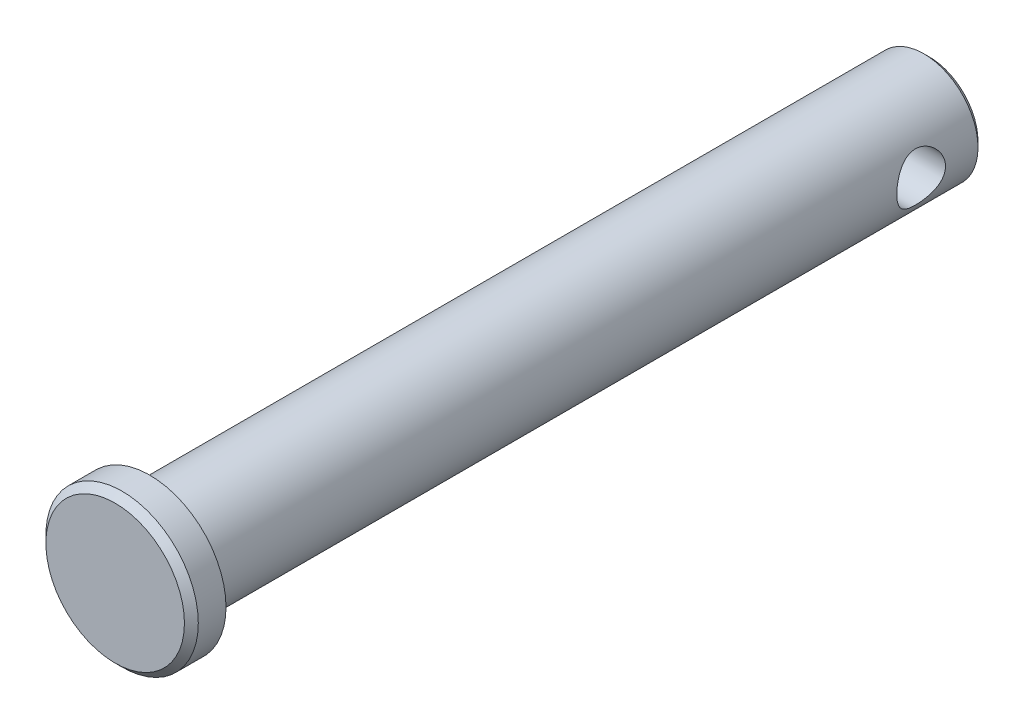
ISO-10303-21;
HEADER;
FILE_DESCRIPTION(('STEP AP214'),'2;1');
FILE_NAME('part.step','',(''),(''),'','','');
FILE_SCHEMA(('AUTOMOTIVE_DESIGN { 1 0 10303 214 1 1 1 1 }'));
ENDSEC;
DATA;
#1=APPLICATION_CONTEXT('core data for automotive mechanical design processes');
#2=APPLICATION_PROTOCOL_DEFINITION('international standard','automotive_design',2000,#1);
#3=PRODUCT_CONTEXT('',#1,'mechanical');
#4=PRODUCT('Part','Part','',(#3));
#5=PRODUCT_RELATED_PRODUCT_CATEGORY('part','',(#4));
#6=PRODUCT_DEFINITION_FORMATION('','',#4);
#7=PRODUCT_DEFINITION_CONTEXT('part definition',#1,'design');
#8=PRODUCT_DEFINITION('design','',#6,#7);
#9=PRODUCT_DEFINITION_SHAPE('','',#8);
#10=(LENGTH_UNIT() NAMED_UNIT(*) SI_UNIT(.MILLI.,.METRE.));
#11=(NAMED_UNIT(*) PLANE_ANGLE_UNIT() SI_UNIT($,.RADIAN.));
#12=(NAMED_UNIT(*) SI_UNIT($,.STERADIAN.) SOLID_ANGLE_UNIT());
#13=UNCERTAINTY_MEASURE_WITH_UNIT(LENGTH_MEASURE(1.E-05),#10,'distance_accuracy_value','');
#14=(GEOMETRIC_REPRESENTATION_CONTEXT(3) GLOBAL_UNCERTAINTY_ASSIGNED_CONTEXT((#13)) GLOBAL_UNIT_ASSIGNED_CONTEXT((#10,
#11,#12)) REPRESENTATION_CONTEXT('',''));
#15=CARTESIAN_POINT('',(0.,0.,0.));
#16=DIRECTION('',(0.,0.,1.));
#17=DIRECTION('',(1.,0.,0.));
#18=AXIS2_PLACEMENT_3D('',#15,#16,#17);
#19=CARTESIAN_POINT('',(0.,0.,28.575));
#20=DIRECTION('',(0.,0.,-1.));
#21=DIRECTION('',(-1.,0.,0.));
#22=AXIS2_PLACEMENT_3D('',#19,#20,#21);
#23=CYLINDRICAL_SURFACE('',#22,3.96875);
#24=CARTESIAN_POINT('',(0.,0.,-28.178125));
#25=DIRECTION('',(0.,0.,1.));
#26=DIRECTION('',(1.,0.,0.));
#27=AXIS2_PLACEMENT_3D('',#24,#25,#26);
#28=CIRCLE('',#27,3.96875);
#29=CARTESIAN_POINT('',(3.96875,0.,-28.178125));
#30=VERTEX_POINT('',#29);
#31=EDGE_CURVE('E39',#30,#30,#28,.T.);
#32=ORIENTED_EDGE('',*,*,#31,.T.);
#33=EDGE_LOOP('',(#32));
#34=FACE_BOUND('',#33,.T.);
#35=CARTESIAN_POINT('',(-3.96875,0.,-22.225));
#36=CARTESIAN_POINT('',(-3.96874617438622,-0.0949778738234464,-22.2250046427767));
#37=CARTESIAN_POINT('',(-3.96530259934115,-0.190100910102063,-22.2326211474799));
#38=CARTESIAN_POINT('',(-3.95186976524683,-0.377603398261746,-22.2627821054392));
#39=CARTESIAN_POINT('',(-3.94186507359599,-0.469975843546831,-22.2853617552799));
#40=CARTESIAN_POINT('',(-3.91637069606117,-0.648968721826522,-22.3444262458808));
#41=CARTESIAN_POINT('',(-3.90090078285467,-0.73560857063118,-22.3808609959748));
#42=CARTESIAN_POINT('',(-3.86594877361354,-0.9014479992857,-22.4663743710802));
#43=CARTESIAN_POINT('',(-3.84646753179613,-0.980649157993283,-22.5154503046938));
#44=CARTESIAN_POINT('',(-3.80416954815373,-1.13398432523679,-22.6277723638741));
#45=CARTESIAN_POINT('',(-3.7812323323631,-1.20764366282281,-22.6916206015973));
#46=CARTESIAN_POINT('',(-3.73507740763258,-1.34362938308817,-22.8303950283803));
#47=CARTESIAN_POINT('',(-3.71185953645299,-1.40594884000918,-22.9053279370255));
#48=CARTESIAN_POINT('',(-3.66620670648197,-1.52117571586779,-23.0695331682094));
#49=CARTESIAN_POINT('',(-3.64390071699522,-1.57330159549786,-23.1593936932781));
#50=CARTESIAN_POINT('',(-3.60455031138587,-1.66148802946916,-23.3477446575103));
#51=CARTESIAN_POINT('',(-3.58750275311297,-1.69755818356413,-23.4462298976649));
#52=CARTESIAN_POINT('',(-3.56192529512775,-1.75056975181475,-23.643584616897));
#53=CARTESIAN_POINT('',(-3.55298881993969,-1.76843057064752,-23.7421521796414));
#54=CARTESIAN_POINT('',(-3.54350139065343,-1.78737214090788,-23.9412584741968));
#55=CARTESIAN_POINT('',(-3.54294461635166,-1.78846453901733,-24.0417957892951));
#56=CARTESIAN_POINT('',(-3.54994141249622,-1.77452269382132,-24.2320619163113));
#57=CARTESIAN_POINT('',(-3.55675159739714,-1.76096672628881,-24.3219322875282));
#58=CARTESIAN_POINT('',(-3.57644085651668,-1.72062366969459,-24.4979523188023));
#59=CARTESIAN_POINT('',(-3.58932134024889,-1.69383350760461,-24.5841011096402));
#60=CARTESIAN_POINT('',(-3.61999879597095,-1.62725210855022,-24.7525688156485));
#61=CARTESIAN_POINT('',(-3.63790043052348,-1.58718038036525,-24.834756944716));
#62=CARTESIAN_POINT('',(-3.67658878575605,-1.49537598597763,-24.9915950627164));
#63=CARTESIAN_POINT('',(-3.69737673266191,-1.44363835775408,-25.0662418243522));
#64=CARTESIAN_POINT('',(-3.74202161728027,-1.32390460607897,-25.2137470977053));
#65=CARTESIAN_POINT('',(-3.76597742851696,-1.25479921909777,-25.2856780777331));
#66=CARTESIAN_POINT('',(-3.81252979441669,-1.10531402437862,-25.4172706801132));
#67=CARTESIAN_POINT('',(-3.83512591597318,-1.02493065110592,-25.4769284075093));
#68=CARTESIAN_POINT('',(-3.87728164517011,-0.851950400611567,-25.5839624966866));
#69=CARTESIAN_POINT('',(-3.89672549715337,-0.759052301739587,-25.6309011333037));
#70=CARTESIAN_POINT('',(-3.92946512008061,-0.565578480308637,-25.7081480148423));
#71=CARTESIAN_POINT('',(-3.94276486430751,-0.465007768662619,-25.738467009758));
#72=CARTESIAN_POINT('',(-3.96093706398566,-0.266740423937717,-25.7795331552533));
#73=CARTESIAN_POINT('',(-3.96634260111458,-0.169349837037099,-25.7915212438187));
#74=CARTESIAN_POINT('',(-3.96986639576799,0.0261960161241927,-25.7993589404276));
#75=CARTESIAN_POINT('',(-3.96798721258835,0.124351001740544,-25.7952142163107));
#76=CARTESIAN_POINT('',(-3.9574884590475,0.312425077700258,-25.7717349306814));
#77=CARTESIAN_POINT('',(-3.94927933787845,0.402485338607084,-25.7533250159671));
#78=CARTESIAN_POINT('',(-3.92741674577169,0.578108898424094,-25.7031862033162));
#79=CARTESIAN_POINT('',(-3.91376261909991,0.663671654301141,-25.6714557011765));
#80=CARTESIAN_POINT('',(-3.88175972760448,0.830900107030836,-25.5945762664853));
#81=CARTESIAN_POINT('',(-3.86327809956836,0.912361689031191,-25.5490405132584));
#82=CARTESIAN_POINT('',(-3.82352241163919,1.0667805898273,-25.4462646377431));
#83=CARTESIAN_POINT('',(-3.80224713175163,1.13973416672261,-25.3890193957655));
#84=CARTESIAN_POINT('',(-3.7569861365271,1.28140881747875,-25.2589582979106));
#85=CARTESIAN_POINT('',(-3.73292154548769,1.34928558884681,-25.1852480267837));
#86=CARTESIAN_POINT('',(-3.68626006612451,1.47199966484125,-25.0272069274033));
#87=CARTESIAN_POINT('',(-3.66366374315174,1.52683196811846,-24.9428720444865));
#88=CARTESIAN_POINT('',(-3.6220582670028,1.62311458805353,-24.7630854798547));
#89=CARTESIAN_POINT('',(-3.60315571336035,1.6641865299815,-24.6674045361922));
#90=CARTESIAN_POINT('',(-3.57239877714008,1.72923710343425,-24.4693548110904));
#91=CARTESIAN_POINT('',(-3.5605372740767,1.75323300854316,-24.3669929026995));
#92=CARTESIAN_POINT('',(-3.54641768025877,1.78160782388325,-24.1679829916353));
#93=CARTESIAN_POINT('',(-3.54341998323755,1.78749927212071,-24.0716029311388));
#94=CARTESIAN_POINT('',(-3.54535000484541,1.78366948684158,-23.8792459226279));
#95=CARTESIAN_POINT('',(-3.55027591495678,1.77395181601726,-23.7832688876381));
#96=CARTESIAN_POINT('',(-3.56677687348632,1.74051392909838,-23.600753041163));
#97=CARTESIAN_POINT('',(-3.57791211367527,1.71771729466601,-23.5140010549911));
#98=CARTESIAN_POINT('',(-3.6051626662439,1.65975853119642,-23.3455710308186));
#99=CARTESIAN_POINT('',(-3.62127942761947,1.62459280389832,-23.2638944774435));
#100=CARTESIAN_POINT('',(-3.65796501776635,1.54029485813948,-23.1021393255862));
#101=CARTESIAN_POINT('',(-3.67875446372189,1.49040607677893,-23.022506198301));
#102=CARTESIAN_POINT('',(-3.7219314339033,1.37904587307234,-22.8722730048114));
#103=CARTESIAN_POINT('',(-3.74431964392808,1.31756946138292,-22.80167685177));
#104=CARTESIAN_POINT('',(-3.7906044226433,1.17819988334134,-22.6649100431823));
#105=CARTESIAN_POINT('',(-3.81445387976054,1.09932398288879,-22.5997198054072));
#106=CARTESIAN_POINT('',(-3.85900563461188,0.930928545506918,-22.4833857784195));
#107=CARTESIAN_POINT('',(-3.87970648291034,0.841404140216964,-22.4322484496596));
#108=CARTESIAN_POINT('',(-3.91548302476265,0.654900541569406,-22.3462695978331));
#109=CARTESIAN_POINT('',(-3.9306127661094,0.55800461146758,-22.311270622202));
#110=CARTESIAN_POINT('',(-3.95373955592654,0.358998712324301,-22.2584461799785));
#111=CARTESIAN_POINT('',(-3.9617582306156,0.256905557576824,-22.2405686302521));
#112=CARTESIAN_POINT('',(-3.96675460869473,0.128456865581506,-22.2294387628093));
#113=CARTESIAN_POINT('',(-3.96750154708539,0.102802547124715,-22.2277758382382));
#114=CARTESIAN_POINT('',(-3.96849976418159,0.0514357022290038,-22.2255558205572));
#115=CARTESIAN_POINT('',(-3.96875103610376,0.0257231749982957,-22.2249987425813));
#116=CARTESIAN_POINT('',(-3.96875,0.,-22.225));
#117=B_SPLINE_CURVE_WITH_KNOTS('',3,(#35,#36,#37,#38,#39,#40,#41,#42,#43,#44,#45,#46,#47,#48,
#49,#50,#51,#52,#53,#54,#55,#56,#57,#58,#59,#60,#61,#62,#63,#64,#65,#66,#67,#68,#69,#70,#71,#72,
#73,#74,#75,#76,#77,#78,#79,#80,#81,#82,#83,#84,#85,#86,#87,#88,#89,#90,#91,#92,#93,#94,#95,#96,
#97,#98,#99,#100,#101,#102,#103,#104,#105,#106,#107,#108,#109,#110,#111,#112,#113,#114,#115,
#116),.UNSPECIFIED.,.T.,.F.,(4,2,2,2,2,2,2,2,2,2,2,2,2,2,2,2,2,2,2,2,2,2,2,2,2,2,2,2,2,2,2,2,2,
2,2,2,2,2,2,2,4),(0.,0.284828038773508,0.570328444753487,0.854806339300564,1.13922371647665,
1.43836698800565,1.73769235057742,2.05484351698026,2.37180480245164,2.67182404149381,
2.97163488960178,3.24379026768139,3.51600887095951,3.79438770250797,4.07288516494024,
4.37926965204658,4.68575122177785,5.00172742428918,5.31749900370299,5.6107643968995,
5.9039267683125,6.17953050358859,6.45516743944876,6.73938144201626,7.02371997688967,
7.33149162707357,7.63938108977513,7.95514987865638,8.27059878990355,8.55885899679168,
8.84705341928244,9.11703762338688,9.38710043294565,9.67464025936009,9.96230417721748,
10.2760302632386,10.5899003361528,10.9006397585277,11.2104308849967,11.2875707589972,
11.3647116886774),.UNSPECIFIED.);
#118=CARTESIAN_POINT('',(-3.96875,0.,-22.225));
#119=VERTEX_POINT('',#118);
#120=EDGE_CURVE('E50',#119,#119,#117,.T.);
#121=ORIENTED_EDGE('',*,*,#120,.T.);
#122=EDGE_LOOP('',(#121));
#123=FACE_BOUND('',#122,.T.);
#124=CARTESIAN_POINT('',(3.96875,0.,-25.796875));
#125=CARTESIAN_POINT('',(3.96874617438622,-0.0949778738234461,-25.7968703572233));
#126=CARTESIAN_POINT('',(3.96530259934115,-0.190100910102062,-25.7892538525201));
#127=CARTESIAN_POINT('',(3.95186976524683,-0.377603398261745,-25.7590928945608));
#128=CARTESIAN_POINT('',(3.94186507359599,-0.469975843546831,-25.7365132447201));
#129=CARTESIAN_POINT('',(3.91637069606117,-0.648968721826522,-25.6774487541192));
#130=CARTESIAN_POINT('',(3.90090078285467,-0.73560857063118,-25.6410140040252));
#131=CARTESIAN_POINT('',(3.86594877361354,-0.9014479992857,-25.5555006289198));
#132=CARTESIAN_POINT('',(3.84646753179613,-0.980649157993283,-25.5064246953062));
#133=CARTESIAN_POINT('',(3.80416954815373,-1.13398432523679,-25.3941026361259));
#134=CARTESIAN_POINT('',(3.7812323323631,-1.20764366282281,-25.3302543984027));
#135=CARTESIAN_POINT('',(3.73507740763258,-1.34362938308817,-25.1914799716197));
#136=CARTESIAN_POINT('',(3.71185953645299,-1.40594884000918,-25.1165470629745));
#137=CARTESIAN_POINT('',(3.66620670648197,-1.52117571586779,-24.9523418317906));
#138=CARTESIAN_POINT('',(3.64390071699522,-1.57330159549786,-24.8624813067219));
#139=CARTESIAN_POINT('',(3.60455031138587,-1.66148802946916,-24.6741303424897));
#140=CARTESIAN_POINT('',(3.58750275311297,-1.69755818356413,-24.5756451023351));
#141=CARTESIAN_POINT('',(3.56192529512775,-1.75056975181475,-24.378290383103));
#142=CARTESIAN_POINT('',(3.55298881993969,-1.76843057064752,-24.2797228203586));
#143=CARTESIAN_POINT('',(3.54350139065343,-1.78737214090788,-24.0806165258032));
#144=CARTESIAN_POINT('',(3.54294461635166,-1.78846453901733,-23.9800792107049));
#145=CARTESIAN_POINT('',(3.54994141249622,-1.77452269382132,-23.7898130836887));
#146=CARTESIAN_POINT('',(3.55675159739714,-1.76096672628881,-23.6999427124718));
#147=CARTESIAN_POINT('',(3.57644085651668,-1.72062366969459,-23.5239226811977));
#148=CARTESIAN_POINT('',(3.58932134024889,-1.69383350760461,-23.4377738903598));
#149=CARTESIAN_POINT('',(3.61999879597095,-1.62725210855022,-23.2693061843515));
#150=CARTESIAN_POINT('',(3.63790043052348,-1.58718038036525,-23.187118055284));
#151=CARTESIAN_POINT('',(3.67658878575605,-1.49537598597763,-23.0302799372836));
#152=CARTESIAN_POINT('',(3.69737673266191,-1.44363835775408,-22.9556331756478));
#153=CARTESIAN_POINT('',(3.74202161728027,-1.32390460607897,-22.8081279022947));
#154=CARTESIAN_POINT('',(3.76597742851696,-1.25479921909777,-22.7361969222669));
#155=CARTESIAN_POINT('',(3.81252979441669,-1.10531402437862,-22.6046043198868));
#156=CARTESIAN_POINT('',(3.83512591597318,-1.02493065110592,-22.5449465924907));
#157=CARTESIAN_POINT('',(3.87728164517011,-0.851950400611567,-22.4379125033134));
#158=CARTESIAN_POINT('',(3.89672549715337,-0.759052301739587,-22.3909738666963));
#159=CARTESIAN_POINT('',(3.92946512008061,-0.565578480308637,-22.3137269851577));
#160=CARTESIAN_POINT('',(3.94276486430751,-0.465007768662619,-22.283407990242));
#161=CARTESIAN_POINT('',(3.96093706398566,-0.266740423937717,-22.2423418447467));
#162=CARTESIAN_POINT('',(3.96634260111458,-0.169349837037099,-22.2303537561813));
#163=CARTESIAN_POINT('',(3.96986639576799,0.0261960161241927,-22.2225160595724));
#164=CARTESIAN_POINT('',(3.96798721258835,0.124351001740544,-22.2266607836893));
#165=CARTESIAN_POINT('',(3.9574884590475,0.312425077700258,-22.2501400693186));
#166=CARTESIAN_POINT('',(3.94927933787845,0.402485338607084,-22.2685499840329));
#167=CARTESIAN_POINT('',(3.92741674577169,0.578108898424094,-22.3186887966838));
#168=CARTESIAN_POINT('',(3.91376261909991,0.663671654301141,-22.3504192988235));
#169=CARTESIAN_POINT('',(3.88175972760448,0.830900107030836,-22.4272987335147));
#170=CARTESIAN_POINT('',(3.86327809956836,0.912361689031191,-22.4728344867416));
#171=CARTESIAN_POINT('',(3.82352241163919,1.0667805898273,-22.5756103622569));
#172=CARTESIAN_POINT('',(3.80224713175163,1.13973416672261,-22.6328556042345));
#173=CARTESIAN_POINT('',(3.7569861365271,1.28140881747875,-22.7629167020894));
#174=CARTESIAN_POINT('',(3.73292154548769,1.34928558884681,-22.8366269732163));
#175=CARTESIAN_POINT('',(3.68626006612451,1.47199966484125,-22.9946680725967));
#176=CARTESIAN_POINT('',(3.66366374315174,1.52683196811846,-23.0790029555135));
#177=CARTESIAN_POINT('',(3.6220582670028,1.62311458805353,-23.2587895201453));
#178=CARTESIAN_POINT('',(3.60315571336035,1.6641865299815,-23.3544704638078));
#179=CARTESIAN_POINT('',(3.57239877714008,1.72923710343425,-23.5525201889096));
#180=CARTESIAN_POINT('',(3.5605372740767,1.75323300854316,-23.6548820973005));
#181=CARTESIAN_POINT('',(3.54641768025877,1.78160782388325,-23.8538920083647));
#182=CARTESIAN_POINT('',(3.54341998323755,1.78749927212071,-23.9502720688612));
#183=CARTESIAN_POINT('',(3.54535000484541,1.78366948684158,-24.1426290773721));
#184=CARTESIAN_POINT('',(3.55027591495678,1.77395181601726,-24.2386061123619));
#185=CARTESIAN_POINT('',(3.56677687348632,1.74051392909838,-24.421121958837));
#186=CARTESIAN_POINT('',(3.57791211367527,1.71771729466601,-24.5078739450089));
#187=CARTESIAN_POINT('',(3.6051626662439,1.65975853119642,-24.6763039691814));
#188=CARTESIAN_POINT('',(3.62127942761947,1.62459280389832,-24.7579805225565));
#189=CARTESIAN_POINT('',(3.65796501776635,1.54029485813948,-24.9197356744138));
#190=CARTESIAN_POINT('',(3.67875446372189,1.49040607677893,-24.999368801699));
#191=CARTESIAN_POINT('',(3.7219314339033,1.37904587307234,-25.1496019951886));
#192=CARTESIAN_POINT('',(3.74431964392808,1.31756946138292,-25.22019814823));
#193=CARTESIAN_POINT('',(3.7906044226433,1.17819988334134,-25.3569649568177));
#194=CARTESIAN_POINT('',(3.81445387976054,1.09932398288879,-25.4221551945928));
#195=CARTESIAN_POINT('',(3.85900563461188,0.930928545506918,-25.5384892215805));
#196=CARTESIAN_POINT('',(3.87970648291034,0.841404140216964,-25.5896265503404));
#197=CARTESIAN_POINT('',(3.91548302476265,0.654900541569406,-25.6756054021669));
#198=CARTESIAN_POINT('',(3.9306127661094,0.55800461146758,-25.710604377798));
#199=CARTESIAN_POINT('',(3.95373955592654,0.358998712324301,-25.7634288200215));
#200=CARTESIAN_POINT('',(3.9617582306156,0.256905557576824,-25.7813063697479));
#201=CARTESIAN_POINT('',(3.96675460869473,0.128456865581506,-25.7924362371907));
#202=CARTESIAN_POINT('',(3.96750154708539,0.102802547124716,-25.7940991617618));
#203=CARTESIAN_POINT('',(3.96849976418159,0.0514357022290039,-25.7963191794428));
#204=CARTESIAN_POINT('',(3.96875103610376,0.0257231749982957,-25.7968762574187));
#205=CARTESIAN_POINT('',(3.96875,0.,-25.796875));
#206=B_SPLINE_CURVE_WITH_KNOTS('',3,(#124,#125,#126,#127,#128,#129,#130,#131,#132,#133,#134,
#135,#136,#137,#138,#139,#140,#141,#142,#143,#144,#145,#146,#147,#148,#149,#150,#151,#152,#153,
#154,#155,#156,#157,#158,#159,#160,#161,#162,#163,#164,#165,#166,#167,#168,#169,#170,#171,#172,
#173,#174,#175,#176,#177,#178,#179,#180,#181,#182,#183,#184,#185,#186,#187,#188,#189,#190,#191,
#192,#193,#194,#195,#196,#197,#198,#199,#200,#201,#202,#203,#204,#205),.UNSPECIFIED.,.T.,.F.,(4,
2,2,2,2,2,2,2,2,2,2,2,2,2,2,2,2,2,2,2,2,2,2,2,2,2,2,2,2,2,2,2,2,2,2,2,2,2,2,2,4),(0.,
0.284828038773507,0.570328444753487,0.854806339300564,1.13922371647665,1.43836698800565,
1.73769235057742,2.05484351698026,2.37180480245164,2.67182404149381,2.97163488960178,
3.24379026768139,3.51600887095951,3.79438770250797,4.07288516494024,4.37926965204658,
4.68575122177785,5.00172742428918,5.31749900370299,5.6107643968995,5.9039267683125,
6.17953050358859,6.45516743944876,6.73938144201626,7.02371997688967,7.33149162707357,
7.63938108977513,7.95514987865638,8.27059878990355,8.55885899679168,8.84705341928244,
9.11703762338688,9.38710043294565,9.67464025936009,9.96230417721748,10.2760302632386,
10.5899003361528,10.9006397585277,11.2104308849967,11.2875707589972,11.3647116886774),.UNSPECIFIED.);
#207=CARTESIAN_POINT('',(3.96875,0.,-25.796875));
#208=VERTEX_POINT('',#207);
#209=EDGE_CURVE('E59',#208,#208,#206,.T.);
#210=ORIENTED_EDGE('',*,*,#209,.T.);
#211=EDGE_LOOP('',(#210));
#212=FACE_BOUND('',#211,.T.);
#213=CARTESIAN_POINT('',(0.,0.,28.575));
#214=DIRECTION('',(0.,0.,1.));
#215=DIRECTION('',(1.,0.,0.));
#216=AXIS2_PLACEMENT_3D('',#213,#214,#215);
#217=CIRCLE('',#216,3.96875);
#218=CARTESIAN_POINT('',(3.96875,0.,28.575));
#219=VERTEX_POINT('',#218);
#220=EDGE_CURVE('E98',#219,#219,#217,.T.);
#221=ORIENTED_EDGE('',*,*,#220,.F.);
#222=EDGE_LOOP('',(#221));
#223=FACE_BOUND('',#222,.T.);
#224=ADVANCED_FACE('F32',(#34,#123,#212,#223),#23,.T.);
#225=CARTESIAN_POINT('',(0.,0.,-28.575));
#226=DIRECTION('',(0.,0.,1.));
#227=DIRECTION('',(1.,0.,0.));
#228=AXIS2_PLACEMENT_3D('',#225,#226,#227);
#229=PLANE('',#228);
#230=CARTESIAN_POINT('',(0.,0.,-28.575));
#231=DIRECTION('',(0.,0.,1.));
#232=DIRECTION('',(1.,0.,0.));
#233=AXIS2_PLACEMENT_3D('',#230,#231,#232);
#234=CIRCLE('',#233,3.57187499999999);
#235=CARTESIAN_POINT('',(3.57187499999999,0.,-28.575));
#236=VERTEX_POINT('',#235);
#237=EDGE_CURVE('E10',#236,#236,#234,.F.);
#238=ORIENTED_EDGE('',*,*,#237,.T.);
#239=EDGE_LOOP('',(#238));
#240=FACE_BOUND('',#239,.T.);
#241=ADVANCED_FACE('F80',(#240),#229,.F.);
#242=CARTESIAN_POINT('',(0.,0.,28.575));
#243=DIRECTION('',(0.,0.,1.));
#244=DIRECTION('',(1.,0.,0.));
#245=AXIS2_PLACEMENT_3D('',#242,#243,#244);
#246=PLANE('',#245);
#247=CARTESIAN_POINT('',(0.,0.,28.575));
#248=DIRECTION('',(0.,0.,1.));
#249=DIRECTION('',(1.,0.,0.));
#250=AXIS2_PLACEMENT_3D('',#247,#248,#249);
#251=CIRCLE('',#250,5.588);
#252=CARTESIAN_POINT('',(5.588,0.,28.575));
#253=VERTEX_POINT('',#252);
#254=EDGE_CURVE('E58',#253,#253,#251,.T.);
#255=ORIENTED_EDGE('',*,*,#254,.F.);
#256=EDGE_LOOP('',(#255));
#257=FACE_BOUND('',#256,.T.);
#258=ORIENTED_EDGE('',*,*,#220,.T.);
#259=EDGE_LOOP('',(#258));
#260=FACE_BOUND('',#259,.T.);
#261=ADVANCED_FACE('F77',(#257,#260),#246,.F.);
#262=CARTESIAN_POINT('',(0.,0.,31.115));
#263=DIRECTION('',(0.,0.,-1.));
#264=DIRECTION('',(-1.,0.,0.));
#265=AXIS2_PLACEMENT_3D('',#262,#263,#264);
#266=CYLINDRICAL_SURFACE('',#265,5.588);
#267=CARTESIAN_POINT('',(0.,0.,30.607));
#268=DIRECTION('',(0.,0.,1.));
#269=DIRECTION('',(1.,0.,0.));
#270=AXIS2_PLACEMENT_3D('',#267,#268,#269);
#271=CIRCLE('',#270,5.588);
#272=CARTESIAN_POINT('',(5.588,0.,30.607));
#273=VERTEX_POINT('',#272);
#274=EDGE_CURVE('E43',#273,#273,#271,.F.);
#275=ORIENTED_EDGE('',*,*,#274,.T.);
#276=EDGE_LOOP('',(#275));
#277=FACE_BOUND('',#276,.T.);
#278=ORIENTED_EDGE('',*,*,#254,.T.);
#279=EDGE_LOOP('',(#278));
#280=FACE_BOUND('',#279,.T.);
#281=ADVANCED_FACE('F75',(#277,#280),#266,.T.);
#282=CARTESIAN_POINT('',(0.,0.,31.115));
#283=DIRECTION('',(0.,0.,1.));
#284=DIRECTION('',(1.,0.,0.));
#285=AXIS2_PLACEMENT_3D('',#282,#283,#284);
#286=PLANE('',#285);
#287=CARTESIAN_POINT('',(0.,0.,31.115));
#288=DIRECTION('',(0.,0.,1.));
#289=DIRECTION('',(1.,0.,0.));
#290=AXIS2_PLACEMENT_3D('',#287,#288,#289);
#291=CIRCLE('',#290,5.08);
#292=CARTESIAN_POINT('',(5.08,0.,31.115));
#293=VERTEX_POINT('',#292);
#294=EDGE_CURVE('E47',#293,#293,#291,.T.);
#295=ORIENTED_EDGE('',*,*,#294,.T.);
#296=EDGE_LOOP('',(#295));
#297=FACE_BOUND('',#296,.T.);
#298=ADVANCED_FACE('F71',(#297),#286,.T.);
#299=CARTESIAN_POINT('',(0.,0.,31.115));
#300=DIRECTION('',(0.,0.,-1.));
#301=DIRECTION('',(-1.,0.,0.));
#302=AXIS2_PLACEMENT_3D('',#299,#300,#301);
#303=CONICAL_SURFACE('',#302,5.08,0.785398163397446);
#304=ORIENTED_EDGE('',*,*,#274,.F.);
#305=EDGE_LOOP('',(#304));
#306=FACE_BOUND('',#305,.T.);
#307=ORIENTED_EDGE('',*,*,#294,.F.);
#308=EDGE_LOOP('',(#307));
#309=FACE_BOUND('',#308,.T.);
#310=ADVANCED_FACE('F69',(#306,#309),#303,.T.);
#311=CARTESIAN_POINT('',(-5.588,0.,-24.0109375));
#312=DIRECTION('',(1.,0.,0.));
#313=DIRECTION('',(0.,0.,-1.));
#314=AXIS2_PLACEMENT_3D('',#311,#312,#313);
#315=CYLINDRICAL_SURFACE('',#314,1.7859375);
#316=ORIENTED_EDGE('',*,*,#209,.F.);
#317=EDGE_LOOP('',(#316));
#318=FACE_BOUND('',#317,.T.);
#319=ORIENTED_EDGE('',*,*,#120,.F.);
#320=EDGE_LOOP('',(#319));
#321=FACE_BOUND('',#320,.T.);
#322=ADVANCED_FACE('F65',(#318,#321),#315,.F.);
#323=CARTESIAN_POINT('',(0.,0.,-28.178125));
#324=DIRECTION('',(0.,0.,1.));
#325=DIRECTION('',(1.,0.,0.));
#326=AXIS2_PLACEMENT_3D('',#323,#324,#325);
#327=CONICAL_SURFACE('',#326,3.96875,0.785398163397448);
#328=ORIENTED_EDGE('',*,*,#237,.F.);
#329=EDGE_LOOP('',(#328));
#330=FACE_BOUND('',#329,.T.);
#331=ORIENTED_EDGE('',*,*,#31,.F.);
#332=EDGE_LOOP('',(#331));
#333=FACE_BOUND('',#332,.T.);
#334=ADVANCED_FACE('F34',(#330,#333),#327,.T.);
#335=CLOSED_SHELL('',(#224,#241,#261,#281,#298,#310,#322,#334));
#336=MANIFOLD_SOLID_BREP('B2',#335);
#337=ADVANCED_BREP_SHAPE_REPRESENTATION('',(#18,#336),#14);
#338=SHAPE_DEFINITION_REPRESENTATION(#9,#337);
ENDSEC;
END-ISO-10303-21;
